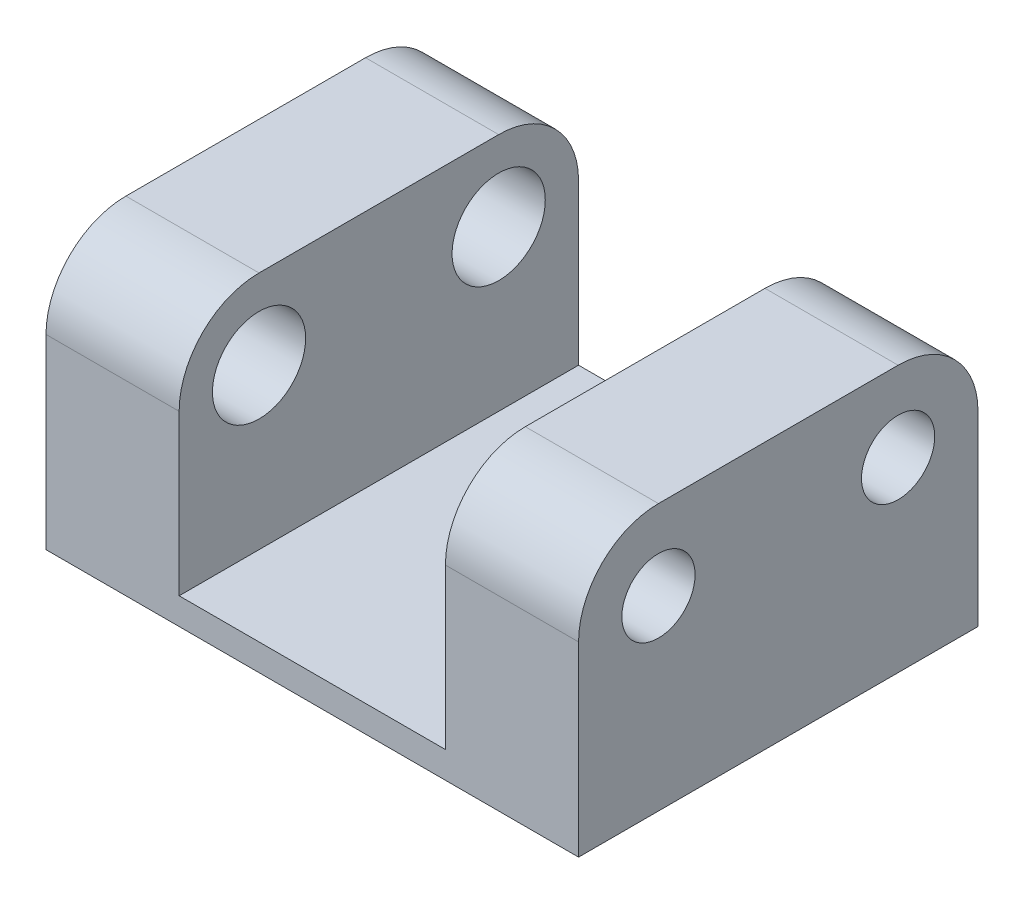
ISO-10303-21;
HEADER;
FILE_DESCRIPTION(('STEP AP214'),'2;1');
FILE_NAME('part.step','',(''),(''),'','','');
FILE_SCHEMA(('AUTOMOTIVE_DESIGN { 1 0 10303 214 1 1 1 1 }'));
ENDSEC;
DATA;
#1=APPLICATION_CONTEXT('core data for automotive mechanical design processes');
#2=APPLICATION_PROTOCOL_DEFINITION('international standard','automotive_design',2000,#1);
#3=PRODUCT_CONTEXT('',#1,'mechanical');
#4=PRODUCT('Part','Part','',(#3));
#5=PRODUCT_RELATED_PRODUCT_CATEGORY('part','',(#4));
#6=PRODUCT_DEFINITION_FORMATION('','',#4);
#7=PRODUCT_DEFINITION_CONTEXT('part definition',#1,'design');
#8=PRODUCT_DEFINITION('design','',#6,#7);
#9=PRODUCT_DEFINITION_SHAPE('','',#8);
#10=(LENGTH_UNIT() NAMED_UNIT(*) SI_UNIT(.MILLI.,.METRE.));
#11=(NAMED_UNIT(*) PLANE_ANGLE_UNIT() SI_UNIT($,.RADIAN.));
#12=(NAMED_UNIT(*) SI_UNIT($,.STERADIAN.) SOLID_ANGLE_UNIT());
#13=UNCERTAINTY_MEASURE_WITH_UNIT(LENGTH_MEASURE(1.E-05),#10,'distance_accuracy_value','');
#14=(GEOMETRIC_REPRESENTATION_CONTEXT(3) GLOBAL_UNCERTAINTY_ASSIGNED_CONTEXT((#13)) GLOBAL_UNIT_ASSIGNED_CONTEXT((#10,
#11,#12)) REPRESENTATION_CONTEXT('',''));
#15=CARTESIAN_POINT('',(0.,0.,0.));
#16=DIRECTION('',(0.,0.,1.));
#17=DIRECTION('',(1.,0.,0.));
#18=AXIS2_PLACEMENT_3D('',#15,#16,#17);
#19=CARTESIAN_POINT('',(20.,20.,30.));
#20=DIRECTION('',(-1.,0.,0.));
#21=DIRECTION('',(0.,-1.,0.));
#22=AXIS2_PLACEMENT_3D('',#19,#20,#21);
#23=PLANE('',#22);
#24=CARTESIAN_POINT('',(20.,14.,24.));
#25=DIRECTION('',(-1.,0.,0.));
#26=DIRECTION('',(0.,-1.,0.));
#27=AXIS2_PLACEMENT_3D('',#24,#25,#26);
#28=CIRCLE('',#27,2.75);
#29=CARTESIAN_POINT('',(20.,11.25,24.));
#30=VERTEX_POINT('',#29);
#31=EDGE_CURVE('E198',#30,#30,#28,.F.);
#32=ORIENTED_EDGE('',*,*,#31,.F.);
#33=EDGE_LOOP('',(#32));
#34=FACE_BOUND('',#33,.T.);
#35=CARTESIAN_POINT('',(20.,14.,6.));
#36=DIRECTION('',(-1.,0.,0.));
#37=DIRECTION('',(0.,-1.,0.));
#38=AXIS2_PLACEMENT_3D('',#35,#36,#37);
#39=CIRCLE('',#38,2.75);
#40=CARTESIAN_POINT('',(20.,11.25,6.));
#41=VERTEX_POINT('',#40);
#42=EDGE_CURVE('E195',#41,#41,#39,.F.);
#43=ORIENTED_EDGE('',*,*,#42,.F.);
#44=EDGE_LOOP('',(#43));
#45=FACE_BOUND('',#44,.T.);
#46=DIRECTION('',(0.,0.,-1.));
#47=VECTOR('',#46,1.);
#48=CARTESIAN_POINT('',(20.,20.,30.));
#49=LINE('',#48,#47);
#50=CARTESIAN_POINT('',(20.,20.,24.));
#51=VERTEX_POINT('',#50);
#52=CARTESIAN_POINT('',(20.,20.,6.));
#53=VERTEX_POINT('',#52);
#54=EDGE_CURVE('E153',#51,#53,#49,.T.);
#55=ORIENTED_EDGE('',*,*,#54,.F.);
#56=CARTESIAN_POINT('',(20.,14.,24.));
#57=DIRECTION('',(-1.,0.,0.));
#58=DIRECTION('',(0.,-1.,0.));
#59=AXIS2_PLACEMENT_3D('',#56,#57,#58);
#60=CIRCLE('',#59,6.);
#61=CARTESIAN_POINT('',(20.,14.,30.));
#62=VERTEX_POINT('',#61);
#63=EDGE_CURVE('E132',#51,#62,#60,.F.);
#64=ORIENTED_EDGE('',*,*,#63,.T.);
#65=DIRECTION('',(0.,1.,0.));
#66=VECTOR('',#65,1.);
#67=CARTESIAN_POINT('',(20.,20.,30.));
#68=LINE('',#67,#66);
#69=CARTESIAN_POINT('',(20.,0.,30.));
#70=VERTEX_POINT('',#69);
#71=EDGE_CURVE('E125',#70,#62,#68,.T.);
#72=ORIENTED_EDGE('',*,*,#71,.F.);
#73=DIRECTION('',(0.,0.,-1.));
#74=VECTOR('',#73,1.);
#75=CARTESIAN_POINT('',(20.,0.,30.));
#76=LINE('',#75,#74);
#77=CARTESIAN_POINT('',(20.,0.,0.));
#78=VERTEX_POINT('',#77);
#79=EDGE_CURVE('E130',#70,#78,#76,.T.);
#80=ORIENTED_EDGE('',*,*,#79,.T.);
#81=DIRECTION('',(0.,1.,0.));
#82=VECTOR('',#81,1.);
#83=CARTESIAN_POINT('',(20.,20.,0.));
#84=LINE('',#83,#82);
#85=CARTESIAN_POINT('',(20.,14.,0.));
#86=VERTEX_POINT('',#85);
#87=EDGE_CURVE('E212',#78,#86,#84,.T.);
#88=ORIENTED_EDGE('',*,*,#87,.T.);
#89=CARTESIAN_POINT('',(20.,14.,6.));
#90=DIRECTION('',(-1.,0.,0.));
#91=DIRECTION('',(0.,-1.,0.));
#92=AXIS2_PLACEMENT_3D('',#89,#90,#91);
#93=CIRCLE('',#92,6.);
#94=EDGE_CURVE('E172',#86,#53,#93,.F.);
#95=ORIENTED_EDGE('',*,*,#94,.T.);
#96=EDGE_LOOP('',(#55,#64,#72,#80,#88,#95));
#97=FACE_BOUND('',#96,.T.);
#98=ADVANCED_FACE('F33',(#34,#45,#97),#23,.F.);
#99=CARTESIAN_POINT('',(10.,20.,30.));
#100=DIRECTION('',(0.,-1.,0.));
#101=DIRECTION('',(0.,0.,-1.));
#102=AXIS2_PLACEMENT_3D('',#99,#100,#101);
#103=PLANE('',#102);
#104=DIRECTION('',(0.,0.,-1.));
#105=VECTOR('',#104,1.);
#106=CARTESIAN_POINT('',(10.,20.,30.));
#107=LINE('',#106,#105);
#108=CARTESIAN_POINT('',(10.,20.,24.));
#109=VERTEX_POINT('',#108);
#110=CARTESIAN_POINT('',(10.,20.,6.));
#111=VERTEX_POINT('',#110);
#112=EDGE_CURVE('E158',#109,#111,#107,.T.);
#113=ORIENTED_EDGE('',*,*,#112,.F.);
#114=DIRECTION('',(-1.,0.,0.));
#115=VECTOR('',#114,1.);
#116=CARTESIAN_POINT('',(10.,20.,24.));
#117=LINE('',#116,#115);
#118=EDGE_CURVE('E170',#109,#51,#117,.F.);
#119=ORIENTED_EDGE('',*,*,#118,.T.);
#120=ORIENTED_EDGE('',*,*,#54,.T.);
#121=DIRECTION('',(-1.,0.,0.));
#122=VECTOR('',#121,1.);
#123=CARTESIAN_POINT('',(10.,20.,6.));
#124=LINE('',#123,#122);
#125=EDGE_CURVE('E167',#53,#111,#124,.T.);
#126=ORIENTED_EDGE('',*,*,#125,.T.);
#127=EDGE_LOOP('',(#113,#119,#120,#126));
#128=FACE_BOUND('',#127,.T.);
#129=ADVANCED_FACE('F251',(#128),#103,.F.);
#130=CARTESIAN_POINT('',(9.99999999999999,2.,30.));
#131=DIRECTION('',(1.,0.,0.));
#132=DIRECTION('',(0.,1.,0.));
#133=AXIS2_PLACEMENT_3D('',#130,#131,#132);
#134=PLANE('',#133);
#135=CARTESIAN_POINT('',(10.,14.,24.));
#136=DIRECTION('',(1.,0.,0.));
#137=DIRECTION('',(0.,1.,0.));
#138=AXIS2_PLACEMENT_3D('',#135,#136,#137);
#139=CIRCLE('',#138,2.75);
#140=CARTESIAN_POINT('',(10.,16.75,24.));
#141=VERTEX_POINT('',#140);
#142=EDGE_CURVE('E37',#141,#141,#139,.F.);
#143=ORIENTED_EDGE('',*,*,#142,.F.);
#144=EDGE_LOOP('',(#143));
#145=FACE_BOUND('',#144,.T.);
#146=CARTESIAN_POINT('',(10.,14.,6.));
#147=DIRECTION('',(1.,0.,0.));
#148=DIRECTION('',(0.,1.,0.));
#149=AXIS2_PLACEMENT_3D('',#146,#147,#148);
#150=CIRCLE('',#149,2.75);
#151=CARTESIAN_POINT('',(10.,16.75,6.));
#152=VERTEX_POINT('',#151);
#153=EDGE_CURVE('E196',#152,#152,#150,.F.);
#154=ORIENTED_EDGE('',*,*,#153,.F.);
#155=EDGE_LOOP('',(#154));
#156=FACE_BOUND('',#155,.T.);
#157=DIRECTION('',(0.,-1.,0.));
#158=VECTOR('',#157,1.);
#159=CARTESIAN_POINT('',(9.99999999999999,2.,30.));
#160=LINE('',#159,#158);
#161=CARTESIAN_POINT('',(10.,14.,30.));
#162=VERTEX_POINT('',#161);
#163=CARTESIAN_POINT('',(9.99999999999999,2.,30.));
#164=VERTEX_POINT('',#163);
#165=EDGE_CURVE('E136',#162,#164,#160,.T.);
#166=ORIENTED_EDGE('',*,*,#165,.F.);
#167=CARTESIAN_POINT('',(10.,14.,24.));
#168=DIRECTION('',(1.,0.,0.));
#169=DIRECTION('',(0.,1.,0.));
#170=AXIS2_PLACEMENT_3D('',#167,#168,#169);
#171=CIRCLE('',#170,6.);
#172=EDGE_CURVE('E165',#162,#109,#171,.F.);
#173=ORIENTED_EDGE('',*,*,#172,.T.);
#174=ORIENTED_EDGE('',*,*,#112,.T.);
#175=CARTESIAN_POINT('',(10.,14.,6.));
#176=DIRECTION('',(1.,0.,0.));
#177=DIRECTION('',(0.,1.,0.));
#178=AXIS2_PLACEMENT_3D('',#175,#176,#177);
#179=CIRCLE('',#178,6.);
#180=CARTESIAN_POINT('',(10.,14.,0.));
#181=VERTEX_POINT('',#180);
#182=EDGE_CURVE('E163',#111,#181,#179,.F.);
#183=ORIENTED_EDGE('',*,*,#182,.T.);
#184=DIRECTION('',(0.,-1.,0.));
#185=VECTOR('',#184,1.);
#186=CARTESIAN_POINT('',(9.99999999999999,2.,0.));
#187=LINE('',#186,#185);
#188=CARTESIAN_POINT('',(9.99999999999999,2.,0.));
#189=VERTEX_POINT('',#188);
#190=EDGE_CURVE('E223',#181,#189,#187,.T.);
#191=ORIENTED_EDGE('',*,*,#190,.T.);
#192=DIRECTION('',(0.,0.,-1.));
#193=VECTOR('',#192,1.);
#194=CARTESIAN_POINT('',(9.99999999999999,2.,30.));
#195=LINE('',#194,#193);
#196=EDGE_CURVE('E241',#164,#189,#195,.T.);
#197=ORIENTED_EDGE('',*,*,#196,.F.);
#198=EDGE_LOOP('',(#166,#173,#174,#183,#191,#197));
#199=FACE_BOUND('',#198,.T.);
#200=ADVANCED_FACE('F247',(#145,#156,#199),#134,.F.);
#201=CARTESIAN_POINT('',(-10.,2.,30.));
#202=DIRECTION('',(0.,-1.,0.));
#203=DIRECTION('',(1.,0.,0.));
#204=AXIS2_PLACEMENT_3D('',#201,#202,#203);
#205=PLANE('',#204);
#206=DIRECTION('',(-1.,0.,0.));
#207=VECTOR('',#206,1.);
#208=CARTESIAN_POINT('',(-10.,2.,0.));
#209=LINE('',#208,#207);
#210=CARTESIAN_POINT('',(-10.,2.,0.));
#211=VERTEX_POINT('',#210);
#212=EDGE_CURVE('E225',#189,#211,#209,.T.);
#213=ORIENTED_EDGE('',*,*,#212,.T.);
#214=DIRECTION('',(0.,0.,-1.));
#215=VECTOR('',#214,1.);
#216=CARTESIAN_POINT('',(-10.,2.,30.));
#217=LINE('',#216,#215);
#218=CARTESIAN_POINT('',(-10.,2.,30.));
#219=VERTEX_POINT('',#218);
#220=EDGE_CURVE('E238',#219,#211,#217,.T.);
#221=ORIENTED_EDGE('',*,*,#220,.F.);
#222=DIRECTION('',(-1.,0.,0.));
#223=VECTOR('',#222,1.);
#224=CARTESIAN_POINT('',(-10.,2.,30.));
#225=LINE('',#224,#223);
#226=EDGE_CURVE('E215',#164,#219,#225,.T.);
#227=ORIENTED_EDGE('',*,*,#226,.F.);
#228=ORIENTED_EDGE('',*,*,#196,.T.);
#229=EDGE_LOOP('',(#213,#221,#227,#228));
#230=FACE_BOUND('',#229,.T.);
#231=ADVANCED_FACE('F260',(#230),#205,.F.);
#232=CARTESIAN_POINT('',(-10.,20.,30.));
#233=DIRECTION('',(-1.,0.,0.));
#234=DIRECTION('',(0.,-1.,0.));
#235=AXIS2_PLACEMENT_3D('',#232,#233,#234);
#236=PLANE('',#235);
#237=CARTESIAN_POINT('',(-10.,14.,6.));
#238=DIRECTION('',(-1.,0.,0.));
#239=DIRECTION('',(0.,-1.,0.));
#240=AXIS2_PLACEMENT_3D('',#237,#238,#239);
#241=CIRCLE('',#240,3.5);
#242=CARTESIAN_POINT('',(-10.,10.5,6.));
#243=VERTEX_POINT('',#242);
#244=EDGE_CURVE('E192',#243,#243,#241,.T.);
#245=ORIENTED_EDGE('',*,*,#244,.T.);
#246=EDGE_LOOP('',(#245));
#247=FACE_BOUND('',#246,.T.);
#248=CARTESIAN_POINT('',(-10.,14.,24.));
#249=DIRECTION('',(-1.,0.,0.));
#250=DIRECTION('',(0.,-1.,0.));
#251=AXIS2_PLACEMENT_3D('',#248,#249,#250);
#252=CIRCLE('',#251,3.5);
#253=CARTESIAN_POINT('',(-10.,10.5,24.));
#254=VERTEX_POINT('',#253);
#255=EDGE_CURVE('E191',#254,#254,#252,.T.);
#256=ORIENTED_EDGE('',*,*,#255,.T.);
#257=EDGE_LOOP('',(#256));
#258=FACE_BOUND('',#257,.T.);
#259=DIRECTION('',(0.,0.,-1.));
#260=VECTOR('',#259,1.);
#261=CARTESIAN_POINT('',(-10.,20.,30.));
#262=LINE('',#261,#260);
#263=CARTESIAN_POINT('',(-10.,20.,24.));
#264=VERTEX_POINT('',#263);
#265=CARTESIAN_POINT('',(-10.,20.,6.));
#266=VERTEX_POINT('',#265);
#267=EDGE_CURVE('E236',#264,#266,#262,.T.);
#268=ORIENTED_EDGE('',*,*,#267,.F.);
#269=CARTESIAN_POINT('',(-10.,14.,24.));
#270=DIRECTION('',(-1.,0.,0.));
#271=DIRECTION('',(0.,-1.,0.));
#272=AXIS2_PLACEMENT_3D('',#269,#270,#271);
#273=CIRCLE('',#272,6.);
#274=CARTESIAN_POINT('',(-10.,14.,30.));
#275=VERTEX_POINT('',#274);
#276=EDGE_CURVE('E185',#264,#275,#273,.F.);
#277=ORIENTED_EDGE('',*,*,#276,.T.);
#278=DIRECTION('',(0.,1.,0.));
#279=VECTOR('',#278,1.);
#280=CARTESIAN_POINT('',(-10.,20.,30.));
#281=LINE('',#280,#279);
#282=EDGE_CURVE('E217',#219,#275,#281,.T.);
#283=ORIENTED_EDGE('',*,*,#282,.F.);
#284=ORIENTED_EDGE('',*,*,#220,.T.);
#285=DIRECTION('',(0.,1.,0.));
#286=VECTOR('',#285,1.);
#287=CARTESIAN_POINT('',(-10.,20.,0.));
#288=LINE('',#287,#286);
#289=CARTESIAN_POINT('',(-10.,14.,0.));
#290=VERTEX_POINT('',#289);
#291=EDGE_CURVE('E227',#211,#290,#288,.T.);
#292=ORIENTED_EDGE('',*,*,#291,.T.);
#293=CARTESIAN_POINT('',(-10.,14.,6.));
#294=DIRECTION('',(-1.,0.,0.));
#295=DIRECTION('',(0.,-1.,0.));
#296=AXIS2_PLACEMENT_3D('',#293,#294,#295);
#297=CIRCLE('',#296,6.);
#298=EDGE_CURVE('E55',#290,#266,#297,.F.);
#299=ORIENTED_EDGE('',*,*,#298,.T.);
#300=EDGE_LOOP('',(#268,#277,#283,#284,#292,#299));
#301=FACE_BOUND('',#300,.T.);
#302=ADVANCED_FACE('F320',(#247,#258,#301),#236,.F.);
#303=CARTESIAN_POINT('',(-20.,20.,30.));
#304=DIRECTION('',(0.,-1.,0.));
#305=DIRECTION('',(0.,0.,-1.));
#306=AXIS2_PLACEMENT_3D('',#303,#304,#305);
#307=PLANE('',#306);
#308=DIRECTION('',(0.,0.,-1.));
#309=VECTOR('',#308,1.);
#310=CARTESIAN_POINT('',(-20.,20.,30.));
#311=LINE('',#310,#309);
#312=CARTESIAN_POINT('',(-20.,20.,24.));
#313=VERTEX_POINT('',#312);
#314=CARTESIAN_POINT('',(-20.,20.,6.));
#315=VERTEX_POINT('',#314);
#316=EDGE_CURVE('E233',#313,#315,#311,.T.);
#317=ORIENTED_EDGE('',*,*,#316,.F.);
#318=DIRECTION('',(-1.,0.,0.));
#319=VECTOR('',#318,1.);
#320=CARTESIAN_POINT('',(-20.,20.,24.));
#321=LINE('',#320,#319);
#322=EDGE_CURVE('E182',#313,#264,#321,.F.);
#323=ORIENTED_EDGE('',*,*,#322,.T.);
#324=ORIENTED_EDGE('',*,*,#267,.T.);
#325=DIRECTION('',(-1.,0.,0.));
#326=VECTOR('',#325,1.);
#327=CARTESIAN_POINT('',(-20.,20.,6.));
#328=LINE('',#327,#326);
#329=EDGE_CURVE('E179',#266,#315,#328,.T.);
#330=ORIENTED_EDGE('',*,*,#329,.T.);
#331=EDGE_LOOP('',(#317,#323,#324,#330));
#332=FACE_BOUND('',#331,.T.);
#333=ADVANCED_FACE('F271',(#332),#307,.F.);
#334=CARTESIAN_POINT('',(-20.,0.,30.));
#335=DIRECTION('',(1.,0.,0.));
#336=DIRECTION('',(0.,0.,-1.));
#337=AXIS2_PLACEMENT_3D('',#334,#335,#336);
#338=PLANE('',#337);
#339=CARTESIAN_POINT('',(-20.,14.,6.));
#340=DIRECTION('',(1.,0.,0.));
#341=DIRECTION('',(0.,0.,-1.));
#342=AXIS2_PLACEMENT_3D('',#339,#340,#341);
#343=CIRCLE('',#342,3.5);
#344=CARTESIAN_POINT('',(-20.,14.,2.5));
#345=VERTEX_POINT('',#344);
#346=EDGE_CURVE('E193',#345,#345,#343,.T.);
#347=ORIENTED_EDGE('',*,*,#346,.T.);
#348=EDGE_LOOP('',(#347));
#349=FACE_BOUND('',#348,.T.);
#350=CARTESIAN_POINT('',(-20.,14.,24.));
#351=DIRECTION('',(1.,0.,0.));
#352=DIRECTION('',(0.,0.,-1.));
#353=AXIS2_PLACEMENT_3D('',#350,#351,#352);
#354=CIRCLE('',#353,3.5);
#355=CARTESIAN_POINT('',(-20.,14.,20.5));
#356=VERTEX_POINT('',#355);
#357=EDGE_CURVE('E188',#356,#356,#354,.T.);
#358=ORIENTED_EDGE('',*,*,#357,.T.);
#359=EDGE_LOOP('',(#358));
#360=FACE_BOUND('',#359,.T.);
#361=DIRECTION('',(0.,-1.,0.));
#362=VECTOR('',#361,1.);
#363=CARTESIAN_POINT('',(-20.,0.,30.));
#364=LINE('',#363,#362);
#365=CARTESIAN_POINT('',(-20.,14.,30.));
#366=VERTEX_POINT('',#365);
#367=CARTESIAN_POINT('',(-20.,0.,30.));
#368=VERTEX_POINT('',#367);
#369=EDGE_CURVE('E143',#366,#368,#364,.T.);
#370=ORIENTED_EDGE('',*,*,#369,.F.);
#371=CARTESIAN_POINT('',(-20.,14.,24.));
#372=DIRECTION('',(1.,0.,0.));
#373=DIRECTION('',(0.,0.,-1.));
#374=AXIS2_PLACEMENT_3D('',#371,#372,#373);
#375=CIRCLE('',#374,6.);
#376=EDGE_CURVE('E177',#366,#313,#375,.F.);
#377=ORIENTED_EDGE('',*,*,#376,.T.);
#378=ORIENTED_EDGE('',*,*,#316,.T.);
#379=CARTESIAN_POINT('',(-20.,14.,6.));
#380=DIRECTION('',(1.,0.,0.));
#381=DIRECTION('',(0.,0.,-1.));
#382=AXIS2_PLACEMENT_3D('',#379,#380,#381);
#383=CIRCLE('',#382,6.);
#384=CARTESIAN_POINT('',(-20.,14.,0.));
#385=VERTEX_POINT('',#384);
#386=EDGE_CURVE('E175',#315,#385,#383,.F.);
#387=ORIENTED_EDGE('',*,*,#386,.T.);
#388=DIRECTION('',(0.,-1.,0.));
#389=VECTOR('',#388,1.);
#390=CARTESIAN_POINT('',(-20.,0.,0.));
#391=LINE('',#390,#389);
#392=CARTESIAN_POINT('',(-20.,0.,0.));
#393=VERTEX_POINT('',#392);
#394=EDGE_CURVE('E229',#385,#393,#391,.T.);
#395=ORIENTED_EDGE('',*,*,#394,.T.);
#396=DIRECTION('',(0.,0.,-1.));
#397=VECTOR('',#396,1.);
#398=CARTESIAN_POINT('',(-20.,0.,30.));
#399=LINE('',#398,#397);
#400=EDGE_CURVE('E221',#368,#393,#399,.T.);
#401=ORIENTED_EDGE('',*,*,#400,.F.);
#402=EDGE_LOOP('',(#370,#377,#378,#387,#395,#401));
#403=FACE_BOUND('',#402,.T.);
#404=ADVANCED_FACE('F269',(#349,#360,#403),#338,.F.);
#405=CARTESIAN_POINT('',(0.,0.,30.));
#406=DIRECTION('',(0.,1.,0.));
#407=DIRECTION('',(-1.,0.,0.));
#408=AXIS2_PLACEMENT_3D('',#405,#406,#407);
#409=PLANE('',#408);
#410=DIRECTION('',(1.,0.,0.));
#411=VECTOR('',#410,1.);
#412=CARTESIAN_POINT('',(0.,0.,0.));
#413=LINE('',#412,#411);
#414=EDGE_CURVE('E147',#393,#78,#413,.T.);
#415=ORIENTED_EDGE('',*,*,#414,.T.);
#416=ORIENTED_EDGE('',*,*,#79,.F.);
#417=DIRECTION('',(1.,0.,0.));
#418=VECTOR('',#417,1.);
#419=CARTESIAN_POINT('',(20.,0.,30.));
#420=LINE('',#419,#418);
#421=EDGE_CURVE('E137',#368,#70,#420,.T.);
#422=ORIENTED_EDGE('',*,*,#421,.F.);
#423=ORIENTED_EDGE('',*,*,#400,.T.);
#424=EDGE_LOOP('',(#415,#416,#422,#423));
#425=FACE_BOUND('',#424,.T.);
#426=ADVANCED_FACE('F149',(#425),#409,.F.);
#427=CARTESIAN_POINT('',(0.,0.,30.));
#428=DIRECTION('',(0.,0.,-1.));
#429=DIRECTION('',(-1.,0.,0.));
#430=AXIS2_PLACEMENT_3D('',#427,#428,#429);
#431=PLANE('',#430);
#432=ORIENTED_EDGE('',*,*,#71,.T.);
#433=DIRECTION('',(-1.,0.,0.));
#434=VECTOR('',#433,1.);
#435=CARTESIAN_POINT('',(0.,14.,30.));
#436=LINE('',#435,#434);
#437=EDGE_CURVE('E155',#62,#162,#436,.T.);
#438=ORIENTED_EDGE('',*,*,#437,.T.);
#439=ORIENTED_EDGE('',*,*,#165,.T.);
#440=ORIENTED_EDGE('',*,*,#226,.T.);
#441=ORIENTED_EDGE('',*,*,#282,.T.);
#442=DIRECTION('',(-1.,0.,0.));
#443=VECTOR('',#442,1.);
#444=CARTESIAN_POINT('',(0.,14.,30.));
#445=LINE('',#444,#443);
#446=EDGE_CURVE('E152',#275,#366,#445,.T.);
#447=ORIENTED_EDGE('',*,*,#446,.T.);
#448=ORIENTED_EDGE('',*,*,#369,.T.);
#449=ORIENTED_EDGE('',*,*,#421,.T.);
#450=EDGE_LOOP('',(#432,#438,#439,#440,#441,#447,#448,#449));
#451=FACE_BOUND('',#450,.T.);
#452=ADVANCED_FACE('F140',(#451),#431,.F.);
#453=CARTESIAN_POINT('',(0.,0.,0.));
#454=DIRECTION('',(0.,0.,-1.));
#455=DIRECTION('',(-1.,0.,0.));
#456=AXIS2_PLACEMENT_3D('',#453,#454,#455);
#457=PLANE('',#456);
#458=ORIENTED_EDGE('',*,*,#394,.F.);
#459=DIRECTION('',(-1.,0.,0.));
#460=VECTOR('',#459,1.);
#461=CARTESIAN_POINT('',(-10.,14.,0.));
#462=LINE('',#461,#460);
#463=EDGE_CURVE('E11',#385,#290,#462,.F.);
#464=ORIENTED_EDGE('',*,*,#463,.T.);
#465=ORIENTED_EDGE('',*,*,#291,.F.);
#466=ORIENTED_EDGE('',*,*,#212,.F.);
#467=ORIENTED_EDGE('',*,*,#190,.F.);
#468=DIRECTION('',(-1.,0.,0.));
#469=VECTOR('',#468,1.);
#470=CARTESIAN_POINT('',(20.,14.,0.));
#471=LINE('',#470,#469);
#472=EDGE_CURVE('E42',#181,#86,#471,.F.);
#473=ORIENTED_EDGE('',*,*,#472,.T.);
#474=ORIENTED_EDGE('',*,*,#87,.F.);
#475=ORIENTED_EDGE('',*,*,#414,.F.);
#476=EDGE_LOOP('',(#458,#464,#465,#466,#467,#473,#474,#475));
#477=FACE_BOUND('',#476,.T.);
#478=ADVANCED_FACE('F275',(#477),#457,.T.);
#479=CARTESIAN_POINT('',(0.,14.,24.));
#480=DIRECTION('',(-1.,0.,0.));
#481=DIRECTION('',(0.,0.,1.));
#482=AXIS2_PLACEMENT_3D('',#479,#480,#481);
#483=CYLINDRICAL_SURFACE('',#482,6.);
#484=ORIENTED_EDGE('',*,*,#63,.F.);
#485=ORIENTED_EDGE('',*,*,#118,.F.);
#486=ORIENTED_EDGE('',*,*,#172,.F.);
#487=ORIENTED_EDGE('',*,*,#437,.F.);
#488=EDGE_LOOP('',(#484,#485,#486,#487));
#489=FACE_BOUND('',#488,.T.);
#490=ADVANCED_FACE('F254',(#489),#483,.T.);
#491=CARTESIAN_POINT('',(0.,14.,24.));
#492=DIRECTION('',(-1.,0.,0.));
#493=DIRECTION('',(0.,0.,1.));
#494=AXIS2_PLACEMENT_3D('',#491,#492,#493);
#495=CYLINDRICAL_SURFACE('',#494,6.);
#496=ORIENTED_EDGE('',*,*,#276,.F.);
#497=ORIENTED_EDGE('',*,*,#322,.F.);
#498=ORIENTED_EDGE('',*,*,#376,.F.);
#499=ORIENTED_EDGE('',*,*,#446,.F.);
#500=EDGE_LOOP('',(#496,#497,#498,#499));
#501=FACE_BOUND('',#500,.T.);
#502=ADVANCED_FACE('F265',(#501),#495,.T.);
#503=CARTESIAN_POINT('',(-20.,14.,6.));
#504=DIRECTION('',(1.,0.,0.));
#505=DIRECTION('',(0.,0.,-1.));
#506=AXIS2_PLACEMENT_3D('',#503,#504,#505);
#507=CYLINDRICAL_SURFACE('',#506,6.);
#508=ORIENTED_EDGE('',*,*,#298,.F.);
#509=ORIENTED_EDGE('',*,*,#463,.F.);
#510=ORIENTED_EDGE('',*,*,#386,.F.);
#511=ORIENTED_EDGE('',*,*,#329,.F.);
#512=EDGE_LOOP('',(#508,#509,#510,#511));
#513=FACE_BOUND('',#512,.T.);
#514=ADVANCED_FACE('F274',(#513),#507,.T.);
#515=CARTESIAN_POINT('',(10.,14.,6.));
#516=DIRECTION('',(1.,0.,0.));
#517=DIRECTION('',(0.,0.,-1.));
#518=AXIS2_PLACEMENT_3D('',#515,#516,#517);
#519=CYLINDRICAL_SURFACE('',#518,6.);
#520=ORIENTED_EDGE('',*,*,#94,.F.);
#521=ORIENTED_EDGE('',*,*,#472,.F.);
#522=ORIENTED_EDGE('',*,*,#182,.F.);
#523=ORIENTED_EDGE('',*,*,#125,.F.);
#524=EDGE_LOOP('',(#520,#521,#522,#523));
#525=FACE_BOUND('',#524,.T.);
#526=ADVANCED_FACE('F35',(#525),#519,.T.);
#527=CARTESIAN_POINT('',(-30.,14.,24.));
#528=DIRECTION('',(1.,0.,0.));
#529=DIRECTION('',(0.,0.,-1.));
#530=AXIS2_PLACEMENT_3D('',#527,#528,#529);
#531=CYLINDRICAL_SURFACE('',#530,3.5);
#532=ORIENTED_EDGE('',*,*,#357,.F.);
#533=EDGE_LOOP('',(#532));
#534=FACE_BOUND('',#533,.T.);
#535=ORIENTED_EDGE('',*,*,#255,.F.);
#536=EDGE_LOOP('',(#535));
#537=FACE_BOUND('',#536,.T.);
#538=ADVANCED_FACE('F280',(#534,#537),#531,.F.);
#539=CARTESIAN_POINT('',(-30.,14.,6.));
#540=DIRECTION('',(1.,0.,0.));
#541=DIRECTION('',(0.,0.,-1.));
#542=AXIS2_PLACEMENT_3D('',#539,#540,#541);
#543=CYLINDRICAL_SURFACE('',#542,3.5);
#544=ORIENTED_EDGE('',*,*,#346,.F.);
#545=EDGE_LOOP('',(#544));
#546=FACE_BOUND('',#545,.T.);
#547=ORIENTED_EDGE('',*,*,#244,.F.);
#548=EDGE_LOOP('',(#547));
#549=FACE_BOUND('',#548,.T.);
#550=ADVANCED_FACE('F285',(#546,#549),#543,.F.);
#551=CARTESIAN_POINT('',(30.,14.,6.));
#552=DIRECTION('',(-1.,0.,0.));
#553=DIRECTION('',(0.,0.,1.));
#554=AXIS2_PLACEMENT_3D('',#551,#552,#553);
#555=CYLINDRICAL_SURFACE('',#554,2.75);
#556=ORIENTED_EDGE('',*,*,#153,.T.);
#557=EDGE_LOOP('',(#556));
#558=FACE_BOUND('',#557,.T.);
#559=ORIENTED_EDGE('',*,*,#42,.T.);
#560=EDGE_LOOP('',(#559));
#561=FACE_BOUND('',#560,.T.);
#562=ADVANCED_FACE('F353',(#558,#561),#555,.F.);
#563=CARTESIAN_POINT('',(30.,14.,24.));
#564=DIRECTION('',(-1.,0.,0.));
#565=DIRECTION('',(0.,0.,1.));
#566=AXIS2_PLACEMENT_3D('',#563,#564,#565);
#567=CYLINDRICAL_SURFACE('',#566,2.75);
#568=ORIENTED_EDGE('',*,*,#142,.T.);
#569=EDGE_LOOP('',(#568));
#570=FACE_BOUND('',#569,.T.);
#571=ORIENTED_EDGE('',*,*,#31,.T.);
#572=EDGE_LOOP('',(#571));
#573=FACE_BOUND('',#572,.T.);
#574=ADVANCED_FACE('F377',(#570,#573),#567,.F.);
#575=CLOSED_SHELL('',(#98,#129,#200,#231,#302,#333,#404,#426,#452,#478,#490,#502,#514,#526,#538,
#550,#562,#574));
#576=MANIFOLD_SOLID_BREP('B2',#575);
#577=ADVANCED_BREP_SHAPE_REPRESENTATION('',(#18,#576),#14);
#578=SHAPE_DEFINITION_REPRESENTATION(#9,#577);
ENDSEC;
END-ISO-10303-21;
